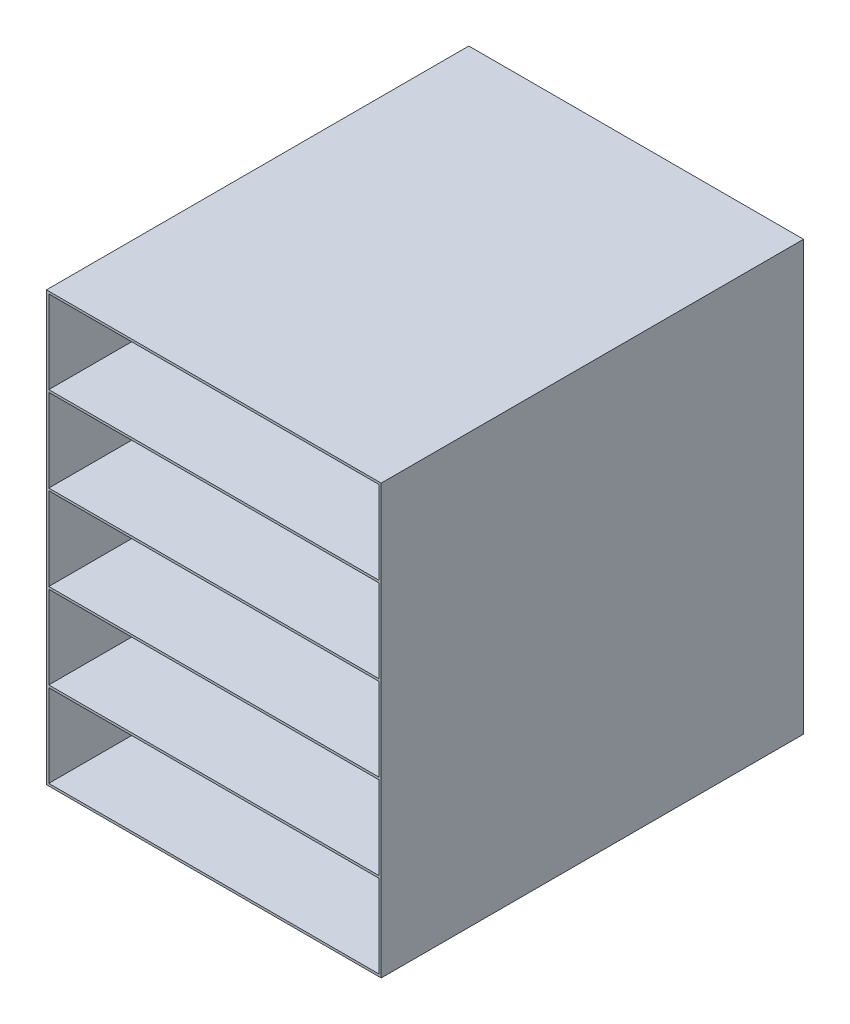
ISO-10303-21;
HEADER;
FILE_DESCRIPTION(('STEP AP214'),'2;1');
FILE_NAME('part.step','',(''),(''),'','','');
FILE_SCHEMA(('AUTOMOTIVE_DESIGN { 1 0 10303 214 1 1 1 1 }'));
ENDSEC;
DATA;
#1=APPLICATION_CONTEXT('core data for automotive mechanical design processes');
#2=APPLICATION_PROTOCOL_DEFINITION('international standard','automotive_design',2000,#1);
#3=PRODUCT_CONTEXT('',#1,'mechanical');
#4=PRODUCT('Part','Part','',(#3));
#5=PRODUCT_RELATED_PRODUCT_CATEGORY('part','',(#4));
#6=PRODUCT_DEFINITION_FORMATION('','',#4);
#7=PRODUCT_DEFINITION_CONTEXT('part definition',#1,'design');
#8=PRODUCT_DEFINITION('design','',#6,#7);
#9=PRODUCT_DEFINITION_SHAPE('','',#8);
#10=(LENGTH_UNIT() NAMED_UNIT(*) SI_UNIT(.MILLI.,.METRE.));
#11=(NAMED_UNIT(*) PLANE_ANGLE_UNIT() SI_UNIT($,.RADIAN.));
#12=(NAMED_UNIT(*) SI_UNIT($,.STERADIAN.) SOLID_ANGLE_UNIT());
#13=UNCERTAINTY_MEASURE_WITH_UNIT(LENGTH_MEASURE(1.E-05),#10,'distance_accuracy_value','');
#14=(GEOMETRIC_REPRESENTATION_CONTEXT(3) GLOBAL_UNCERTAINTY_ASSIGNED_CONTEXT((#13)) GLOBAL_UNIT_ASSIGNED_CONTEXT((#10,
#11,#12)) REPRESENTATION_CONTEXT('',''));
#15=CARTESIAN_POINT('',(0.,0.,0.));
#16=DIRECTION('',(0.,0.,1.));
#17=DIRECTION('',(1.,0.,0.));
#18=AXIS2_PLACEMENT_3D('',#15,#16,#17);
#19=CARTESIAN_POINT('',(0.,0.,135.));
#20=DIRECTION('',(0.,0.,-1.));
#21=DIRECTION('',(-1.,0.,0.));
#22=AXIS2_PLACEMENT_3D('',#19,#20,#21);
#23=PLANE('',#22);
#24=DIRECTION('',(-1.,0.,0.));
#25=VECTOR('',#24,1.);
#26=CARTESIAN_POINT('',(52.75,40.5,135.));
#27=LINE('',#26,#25);
#28=CARTESIAN_POINT('',(52.75,40.5,135.));
#29=VERTEX_POINT('',#28);
#30=CARTESIAN_POINT('',(-52.75,40.5,135.));
#31=VERTEX_POINT('',#30);
#32=EDGE_CURVE('E230',#29,#31,#27,.T.);
#33=ORIENTED_EDGE('',*,*,#32,.F.);
#34=DIRECTION('',(0.,1.,0.));
#35=VECTOR('',#34,1.);
#36=CARTESIAN_POINT('',(52.75,14.,135.));
#37=LINE('',#36,#35);
#38=CARTESIAN_POINT('',(52.75,14.,135.));
#39=VERTEX_POINT('',#38);
#40=EDGE_CURVE('E220',#39,#29,#37,.T.);
#41=ORIENTED_EDGE('',*,*,#40,.F.);
#42=DIRECTION('',(1.,0.,0.));
#43=VECTOR('',#42,1.);
#44=CARTESIAN_POINT('',(-52.75,14.,135.));
#45=LINE('',#44,#43);
#46=CARTESIAN_POINT('',(-52.75,14.,135.));
#47=VERTEX_POINT('',#46);
#48=EDGE_CURVE('E234',#47,#39,#45,.T.);
#49=ORIENTED_EDGE('',*,*,#48,.F.);
#50=DIRECTION('',(0.,-1.,0.));
#51=VECTOR('',#50,1.);
#52=CARTESIAN_POINT('',(-52.75,40.5,135.));
#53=LINE('',#52,#51);
#54=EDGE_CURVE('E55',#31,#47,#53,.T.);
#55=ORIENTED_EDGE('',*,*,#54,.F.);
#56=EDGE_LOOP('',(#33,#41,#49,#55));
#57=FACE_BOUND('',#56,.T.);
#58=DIRECTION('',(-1.,0.,0.));
#59=VECTOR('',#58,1.);
#60=CARTESIAN_POINT('',(52.75,67.75,135.));
#61=LINE('',#60,#59);
#62=CARTESIAN_POINT('',(52.75,67.75,135.));
#63=VERTEX_POINT('',#62);
#64=CARTESIAN_POINT('',(-52.75,67.75,135.));
#65=VERTEX_POINT('',#64);
#66=EDGE_CURVE('E253',#63,#65,#61,.T.);
#67=ORIENTED_EDGE('',*,*,#66,.F.);
#68=DIRECTION('',(0.,1.,0.));
#69=VECTOR('',#68,1.);
#70=CARTESIAN_POINT('',(52.75,41.25,135.));
#71=LINE('',#70,#69);
#72=CARTESIAN_POINT('',(52.75,41.25,135.));
#73=VERTEX_POINT('',#72);
#74=EDGE_CURVE('E257',#73,#63,#71,.T.);
#75=ORIENTED_EDGE('',*,*,#74,.F.);
#76=DIRECTION('',(1.,0.,0.));
#77=VECTOR('',#76,1.);
#78=CARTESIAN_POINT('',(-52.75,41.25,135.));
#79=LINE('',#78,#77);
#80=CARTESIAN_POINT('',(-52.75,41.25,135.));
#81=VERTEX_POINT('',#80);
#82=EDGE_CURVE('E261',#81,#73,#79,.T.);
#83=ORIENTED_EDGE('',*,*,#82,.F.);
#84=DIRECTION('',(0.,-1.,0.));
#85=VECTOR('',#84,1.);
#86=CARTESIAN_POINT('',(-52.75,67.75,135.));
#87=LINE('',#86,#85);
#88=EDGE_CURVE('E63',#65,#81,#87,.T.);
#89=ORIENTED_EDGE('',*,*,#88,.F.);
#90=EDGE_LOOP('',(#67,#75,#83,#89));
#91=FACE_BOUND('',#90,.T.);
#92=DIRECTION('',(-1.,0.,0.));
#93=VECTOR('',#92,1.);
#94=CARTESIAN_POINT('',(52.75,95.,135.));
#95=LINE('',#94,#93);
#96=CARTESIAN_POINT('',(52.75,95.,135.));
#97=VERTEX_POINT('',#96);
#98=CARTESIAN_POINT('',(-52.75,95.,135.));
#99=VERTEX_POINT('',#98);
#100=EDGE_CURVE('E297',#97,#99,#95,.T.);
#101=ORIENTED_EDGE('',*,*,#100,.F.);
#102=DIRECTION('',(0.,1.,0.));
#103=VECTOR('',#102,1.);
#104=CARTESIAN_POINT('',(52.75,68.5,135.));
#105=LINE('',#104,#103);
#106=CARTESIAN_POINT('',(52.75,68.5,135.));
#107=VERTEX_POINT('',#106);
#108=EDGE_CURVE('E301',#107,#97,#105,.T.);
#109=ORIENTED_EDGE('',*,*,#108,.F.);
#110=DIRECTION('',(1.,0.,0.));
#111=VECTOR('',#110,1.);
#112=CARTESIAN_POINT('',(-52.75,68.5,135.));
#113=LINE('',#112,#111);
#114=CARTESIAN_POINT('',(-52.75,68.5,135.));
#115=VERTEX_POINT('',#114);
#116=EDGE_CURVE('E305',#115,#107,#113,.T.);
#117=ORIENTED_EDGE('',*,*,#116,.F.);
#118=DIRECTION('',(0.,-1.,0.));
#119=VECTOR('',#118,1.);
#120=CARTESIAN_POINT('',(-52.75,95.,135.));
#121=LINE('',#120,#119);
#122=EDGE_CURVE('E293',#99,#115,#121,.T.);
#123=ORIENTED_EDGE('',*,*,#122,.F.);
#124=EDGE_LOOP('',(#101,#109,#117,#123));
#125=FACE_BOUND('',#124,.T.);
#126=DIRECTION('',(-1.,0.,0.));
#127=VECTOR('',#126,1.);
#128=CARTESIAN_POINT('',(52.75,122.25,135.));
#129=LINE('',#128,#127);
#130=CARTESIAN_POINT('',(52.75,122.25,135.));
#131=VERTEX_POINT('',#130);
#132=CARTESIAN_POINT('',(-52.75,122.25,135.));
#133=VERTEX_POINT('',#132);
#134=EDGE_CURVE('E341',#131,#133,#129,.T.);
#135=ORIENTED_EDGE('',*,*,#134,.F.);
#136=DIRECTION('',(0.,1.,0.));
#137=VECTOR('',#136,1.);
#138=CARTESIAN_POINT('',(52.75,95.75,135.));
#139=LINE('',#138,#137);
#140=CARTESIAN_POINT('',(52.75,95.75,135.));
#141=VERTEX_POINT('',#140);
#142=EDGE_CURVE('E345',#141,#131,#139,.T.);
#143=ORIENTED_EDGE('',*,*,#142,.F.);
#144=DIRECTION('',(1.,0.,0.));
#145=VECTOR('',#144,1.);
#146=CARTESIAN_POINT('',(-52.75,95.75,135.));
#147=LINE('',#146,#145);
#148=CARTESIAN_POINT('',(-52.75,95.75,135.));
#149=VERTEX_POINT('',#148);
#150=EDGE_CURVE('E349',#149,#141,#147,.T.);
#151=ORIENTED_EDGE('',*,*,#150,.F.);
#152=DIRECTION('',(0.,-1.,0.));
#153=VECTOR('',#152,1.);
#154=CARTESIAN_POINT('',(-52.75,122.25,135.));
#155=LINE('',#154,#153);
#156=EDGE_CURVE('E337',#133,#149,#155,.T.);
#157=ORIENTED_EDGE('',*,*,#156,.F.);
#158=EDGE_LOOP('',(#135,#143,#151,#157));
#159=FACE_BOUND('',#158,.T.);
#160=DIRECTION('',(0.,-1.,0.));
#161=VECTOR('',#160,1.);
#162=CARTESIAN_POINT('',(-52.75,0.,135.));
#163=LINE('',#162,#161);
#164=CARTESIAN_POINT('',(-52.75,13.25,135.));
#165=VERTEX_POINT('',#164);
#166=CARTESIAN_POINT('',(-52.75,-13.25,135.));
#167=VERTEX_POINT('',#166);
#168=EDGE_CURVE('E432',#165,#167,#163,.T.);
#169=ORIENTED_EDGE('',*,*,#168,.F.);
#170=DIRECTION('',(-1.,0.,0.));
#171=VECTOR('',#170,1.);
#172=CARTESIAN_POINT('',(0.,13.25,135.));
#173=LINE('',#172,#171);
#174=CARTESIAN_POINT('',(52.75,13.25,135.));
#175=VERTEX_POINT('',#174);
#176=EDGE_CURVE('E429',#175,#165,#173,.T.);
#177=ORIENTED_EDGE('',*,*,#176,.F.);
#178=DIRECTION('',(0.,1.,0.));
#179=VECTOR('',#178,1.);
#180=CARTESIAN_POINT('',(52.75,0.,135.));
#181=LINE('',#180,#179);
#182=CARTESIAN_POINT('',(52.75,-13.25,135.));
#183=VERTEX_POINT('',#182);
#184=EDGE_CURVE('E426',#183,#175,#181,.T.);
#185=ORIENTED_EDGE('',*,*,#184,.F.);
#186=DIRECTION('',(1.,0.,0.));
#187=VECTOR('',#186,1.);
#188=CARTESIAN_POINT('',(0.,-13.25,135.));
#189=LINE('',#188,#187);
#190=EDGE_CURVE('E411',#167,#183,#189,.T.);
#191=ORIENTED_EDGE('',*,*,#190,.F.);
#192=EDGE_LOOP('',(#169,#177,#185,#191));
#193=FACE_BOUND('',#192,.T.);
#194=DIRECTION('',(0.,-1.,0.));
#195=VECTOR('',#194,1.);
#196=CARTESIAN_POINT('',(-53.5,-14.,135.));
#197=LINE('',#196,#195);
#198=CARTESIAN_POINT('',(-53.5,123.,135.));
#199=VERTEX_POINT('',#198);
#200=CARTESIAN_POINT('',(-53.5,-14.,135.));
#201=VERTEX_POINT('',#200);
#202=EDGE_CURVE('E441',#199,#201,#197,.T.);
#203=ORIENTED_EDGE('',*,*,#202,.T.);
#204=DIRECTION('',(1.,0.,0.));
#205=VECTOR('',#204,1.);
#206=CARTESIAN_POINT('',(-53.5,-14.,135.));
#207=LINE('',#206,#205);
#208=CARTESIAN_POINT('',(53.5,-14.,135.));
#209=VERTEX_POINT('',#208);
#210=EDGE_CURVE('E445',#201,#209,#207,.T.);
#211=ORIENTED_EDGE('',*,*,#210,.T.);
#212=DIRECTION('',(0.,1.,0.));
#213=VECTOR('',#212,1.);
#214=CARTESIAN_POINT('',(53.5,-14.,135.));
#215=LINE('',#214,#213);
#216=CARTESIAN_POINT('',(53.5,123.,135.));
#217=VERTEX_POINT('',#216);
#218=EDGE_CURVE('E438',#209,#217,#215,.T.);
#219=ORIENTED_EDGE('',*,*,#218,.T.);
#220=DIRECTION('',(-1.,0.,0.));
#221=VECTOR('',#220,1.);
#222=CARTESIAN_POINT('',(-53.5,123.,135.));
#223=LINE('',#222,#221);
#224=EDGE_CURVE('E380',#217,#199,#223,.T.);
#225=ORIENTED_EDGE('',*,*,#224,.T.);
#226=EDGE_LOOP('',(#203,#211,#219,#225));
#227=FACE_BOUND('',#226,.T.);
#228=ADVANCED_FACE('F39',(#57,#91,#125,#159,#193,#227),#23,.F.);
#229=CARTESIAN_POINT('',(53.5,-14.,135.));
#230=DIRECTION('',(-1.,0.,0.));
#231=DIRECTION('',(0.,0.,1.));
#232=AXIS2_PLACEMENT_3D('',#229,#230,#231);
#233=PLANE('',#232);
#234=DIRECTION('',(0.,0.,-1.));
#235=VECTOR('',#234,1.);
#236=CARTESIAN_POINT('',(53.5,123.,135.));
#237=LINE('',#236,#235);
#238=CARTESIAN_POINT('',(53.5,123.,0.));
#239=VERTEX_POINT('',#238);
#240=EDGE_CURVE('E391',#217,#239,#237,.T.);
#241=ORIENTED_EDGE('',*,*,#240,.F.);
#242=ORIENTED_EDGE('',*,*,#218,.F.);
#243=DIRECTION('',(0.,0.,-1.));
#244=VECTOR('',#243,1.);
#245=CARTESIAN_POINT('',(53.5,-14.,135.));
#246=LINE('',#245,#244);
#247=CARTESIAN_POINT('',(53.5,-14.,0.));
#248=VERTEX_POINT('',#247);
#249=EDGE_CURVE('E48',#209,#248,#246,.T.);
#250=ORIENTED_EDGE('',*,*,#249,.T.);
#251=DIRECTION('',(0.,1.,0.));
#252=VECTOR('',#251,1.);
#253=CARTESIAN_POINT('',(53.5,-14.,0.));
#254=LINE('',#253,#252);
#255=EDGE_CURVE('E404',#248,#239,#254,.T.);
#256=ORIENTED_EDGE('',*,*,#255,.T.);
#257=EDGE_LOOP('',(#241,#242,#250,#256));
#258=FACE_BOUND('',#257,.T.);
#259=ADVANCED_FACE('F41',(#258),#233,.F.);
#260=CARTESIAN_POINT('',(-53.5,-14.,135.));
#261=DIRECTION('',(1.,0.,0.));
#262=DIRECTION('',(0.,0.,-1.));
#263=AXIS2_PLACEMENT_3D('',#260,#261,#262);
#264=PLANE('',#263);
#265=DIRECTION('',(0.,-1.,0.));
#266=VECTOR('',#265,1.);
#267=CARTESIAN_POINT('',(-53.5,-14.,0.));
#268=LINE('',#267,#266);
#269=CARTESIAN_POINT('',(-53.5,123.,0.));
#270=VERTEX_POINT('',#269);
#271=CARTESIAN_POINT('',(-53.5,-14.,0.));
#272=VERTEX_POINT('',#271);
#273=EDGE_CURVE('E450',#270,#272,#268,.T.);
#274=ORIENTED_EDGE('',*,*,#273,.T.);
#275=DIRECTION('',(0.,0.,-1.));
#276=VECTOR('',#275,1.);
#277=CARTESIAN_POINT('',(-53.5,-14.,135.));
#278=LINE('',#277,#276);
#279=EDGE_CURVE('E11',#201,#272,#278,.T.);
#280=ORIENTED_EDGE('',*,*,#279,.F.);
#281=ORIENTED_EDGE('',*,*,#202,.F.);
#282=DIRECTION('',(0.,0.,-1.));
#283=VECTOR('',#282,1.);
#284=CARTESIAN_POINT('',(-53.5,123.,135.));
#285=LINE('',#284,#283);
#286=EDGE_CURVE('E384',#199,#270,#285,.T.);
#287=ORIENTED_EDGE('',*,*,#286,.T.);
#288=EDGE_LOOP('',(#274,#280,#281,#287));
#289=FACE_BOUND('',#288,.T.);
#290=ADVANCED_FACE('F475',(#289),#264,.F.);
#291=CARTESIAN_POINT('',(-53.5,-14.,135.));
#292=DIRECTION('',(0.,1.,0.));
#293=DIRECTION('',(0.,0.,1.));
#294=AXIS2_PLACEMENT_3D('',#291,#292,#293);
#295=PLANE('',#294);
#296=DIRECTION('',(1.,0.,0.));
#297=VECTOR('',#296,1.);
#298=CARTESIAN_POINT('',(-53.5,-14.,0.));
#299=LINE('',#298,#297);
#300=EDGE_CURVE('E442',#272,#248,#299,.T.);
#301=ORIENTED_EDGE('',*,*,#300,.T.);
#302=ORIENTED_EDGE('',*,*,#249,.F.);
#303=ORIENTED_EDGE('',*,*,#210,.F.);
#304=ORIENTED_EDGE('',*,*,#279,.T.);
#305=EDGE_LOOP('',(#301,#302,#303,#304));
#306=FACE_BOUND('',#305,.T.);
#307=ADVANCED_FACE('F473',(#306),#295,.F.);
#308=CARTESIAN_POINT('',(0.,0.,0.));
#309=DIRECTION('',(0.,0.,-1.));
#310=DIRECTION('',(-1.,0.,0.));
#311=AXIS2_PLACEMENT_3D('',#308,#309,#310);
#312=PLANE('',#311);
#313=DIRECTION('',(-1.,0.,0.));
#314=VECTOR('',#313,1.);
#315=CARTESIAN_POINT('',(-53.5,123.,0.));
#316=LINE('',#315,#314);
#317=EDGE_CURVE('E249',#239,#270,#316,.T.);
#318=ORIENTED_EDGE('',*,*,#317,.F.);
#319=ORIENTED_EDGE('',*,*,#255,.F.);
#320=ORIENTED_EDGE('',*,*,#300,.F.);
#321=ORIENTED_EDGE('',*,*,#273,.F.);
#322=EDGE_LOOP('',(#318,#319,#320,#321));
#323=FACE_BOUND('',#322,.T.);
#324=ADVANCED_FACE('F466',(#323),#312,.T.);
#325=CARTESIAN_POINT('',(52.75,-14.,135.));
#326=DIRECTION('',(-1.,0.,0.));
#327=DIRECTION('',(0.,0.,1.));
#328=AXIS2_PLACEMENT_3D('',#325,#326,#327);
#329=PLANE('',#328);
#330=DIRECTION('',(0.,1.,0.));
#331=VECTOR('',#330,1.);
#332=CARTESIAN_POINT('',(52.75,0.,0.75));
#333=LINE('',#332,#331);
#334=CARTESIAN_POINT('',(52.75,-13.25,0.75));
#335=VERTEX_POINT('',#334);
#336=CARTESIAN_POINT('',(52.75,13.25,0.75));
#337=VERTEX_POINT('',#336);
#338=EDGE_CURVE('E395',#335,#337,#333,.T.);
#339=ORIENTED_EDGE('',*,*,#338,.F.);
#340=DIRECTION('',(0.,0.,-1.));
#341=VECTOR('',#340,1.);
#342=CARTESIAN_POINT('',(52.75,-13.25,135.));
#343=LINE('',#342,#341);
#344=EDGE_CURVE('E406',#183,#335,#343,.T.);
#345=ORIENTED_EDGE('',*,*,#344,.F.);
#346=ORIENTED_EDGE('',*,*,#184,.T.);
#347=DIRECTION('',(0.,0.,-1.));
#348=VECTOR('',#347,1.);
#349=CARTESIAN_POINT('',(52.75,13.25,135.));
#350=LINE('',#349,#348);
#351=EDGE_CURVE('E400',#175,#337,#350,.T.);
#352=ORIENTED_EDGE('',*,*,#351,.T.);
#353=EDGE_LOOP('',(#339,#345,#346,#352));
#354=FACE_BOUND('',#353,.T.);
#355=ADVANCED_FACE('F493',(#354),#329,.T.);
#356=CARTESIAN_POINT('',(-53.5,13.25,135.));
#357=DIRECTION('',(0.,-1.,0.));
#358=DIRECTION('',(0.,0.,-1.));
#359=AXIS2_PLACEMENT_3D('',#356,#357,#358);
#360=PLANE('',#359);
#361=DIRECTION('',(-1.,0.,0.));
#362=VECTOR('',#361,1.);
#363=CARTESIAN_POINT('',(0.,13.25,0.75));
#364=LINE('',#363,#362);
#365=CARTESIAN_POINT('',(-52.75,13.25,0.75));
#366=VERTEX_POINT('',#365);
#367=EDGE_CURVE('E399',#337,#366,#364,.T.);
#368=ORIENTED_EDGE('',*,*,#367,.F.);
#369=ORIENTED_EDGE('',*,*,#351,.F.);
#370=ORIENTED_EDGE('',*,*,#176,.T.);
#371=DIRECTION('',(0.,0.,-1.));
#372=VECTOR('',#371,1.);
#373=CARTESIAN_POINT('',(-52.75,13.25,135.));
#374=LINE('',#373,#372);
#375=EDGE_CURVE('E405',#165,#366,#374,.T.);
#376=ORIENTED_EDGE('',*,*,#375,.T.);
#377=EDGE_LOOP('',(#368,#369,#370,#376));
#378=FACE_BOUND('',#377,.T.);
#379=ADVANCED_FACE('F497',(#378),#360,.T.);
#380=CARTESIAN_POINT('',(-52.75,-14.,135.));
#381=DIRECTION('',(1.,0.,0.));
#382=DIRECTION('',(0.,0.,-1.));
#383=AXIS2_PLACEMENT_3D('',#380,#381,#382);
#384=PLANE('',#383);
#385=DIRECTION('',(0.,-1.,0.));
#386=VECTOR('',#385,1.);
#387=CARTESIAN_POINT('',(-52.75,0.,0.75));
#388=LINE('',#387,#386);
#389=CARTESIAN_POINT('',(-52.75,-13.25,0.75));
#390=VERTEX_POINT('',#389);
#391=EDGE_CURVE('E414',#366,#390,#388,.T.);
#392=ORIENTED_EDGE('',*,*,#391,.F.);
#393=ORIENTED_EDGE('',*,*,#375,.F.);
#394=ORIENTED_EDGE('',*,*,#168,.T.);
#395=DIRECTION('',(0.,0.,-1.));
#396=VECTOR('',#395,1.);
#397=CARTESIAN_POINT('',(-52.75,-13.25,135.));
#398=LINE('',#397,#396);
#399=EDGE_CURVE('E410',#167,#390,#398,.T.);
#400=ORIENTED_EDGE('',*,*,#399,.T.);
#401=EDGE_LOOP('',(#392,#393,#394,#400));
#402=FACE_BOUND('',#401,.T.);
#403=ADVANCED_FACE('F503',(#402),#384,.T.);
#404=CARTESIAN_POINT('',(-53.5,-13.25,135.));
#405=DIRECTION('',(0.,1.,0.));
#406=DIRECTION('',(0.,0.,1.));
#407=AXIS2_PLACEMENT_3D('',#404,#405,#406);
#408=PLANE('',#407);
#409=DIRECTION('',(1.,0.,0.));
#410=VECTOR('',#409,1.);
#411=CARTESIAN_POINT('',(0.,-13.25,0.75));
#412=LINE('',#411,#410);
#413=EDGE_CURVE('E420',#390,#335,#412,.T.);
#414=ORIENTED_EDGE('',*,*,#413,.F.);
#415=ORIENTED_EDGE('',*,*,#399,.F.);
#416=ORIENTED_EDGE('',*,*,#190,.T.);
#417=ORIENTED_EDGE('',*,*,#344,.T.);
#418=EDGE_LOOP('',(#414,#415,#416,#417));
#419=FACE_BOUND('',#418,.T.);
#420=ADVANCED_FACE('F511',(#419),#408,.T.);
#421=CARTESIAN_POINT('',(0.,0.,0.75));
#422=DIRECTION('',(0.,0.,-1.));
#423=DIRECTION('',(-1.,0.,0.));
#424=AXIS2_PLACEMENT_3D('',#421,#422,#423);
#425=PLANE('',#424);
#426=ORIENTED_EDGE('',*,*,#338,.T.);
#427=ORIENTED_EDGE('',*,*,#367,.T.);
#428=ORIENTED_EDGE('',*,*,#391,.T.);
#429=ORIENTED_EDGE('',*,*,#413,.T.);
#430=EDGE_LOOP('',(#426,#427,#428,#429));
#431=FACE_BOUND('',#430,.T.);
#432=ADVANCED_FACE('F490',(#431),#425,.F.);
#433=CARTESIAN_POINT('',(-53.5,123.,135.));
#434=DIRECTION('',(0.,-1.,0.));
#435=DIRECTION('',(0.,0.,-1.));
#436=AXIS2_PLACEMENT_3D('',#433,#434,#435);
#437=PLANE('',#436);
#438=ORIENTED_EDGE('',*,*,#317,.T.);
#439=ORIENTED_EDGE('',*,*,#286,.F.);
#440=ORIENTED_EDGE('',*,*,#224,.F.);
#441=ORIENTED_EDGE('',*,*,#240,.T.);
#442=EDGE_LOOP('',(#438,#439,#440,#441));
#443=FACE_BOUND('',#442,.T.);
#444=ADVANCED_FACE('F470',(#443),#437,.F.);
#445=CARTESIAN_POINT('',(0.,0.,0.75));
#446=DIRECTION('',(0.,0.,-1.));
#447=DIRECTION('',(-1.,0.,0.));
#448=AXIS2_PLACEMENT_3D('',#445,#446,#447);
#449=PLANE('',#448);
#450=DIRECTION('',(1.,0.,0.));
#451=VECTOR('',#450,1.);
#452=CARTESIAN_POINT('',(-52.75,95.75,0.750000000000001));
#453=LINE('',#452,#451);
#454=CARTESIAN_POINT('',(-52.75,95.75,0.750000000000001));
#455=VERTEX_POINT('',#454);
#456=CARTESIAN_POINT('',(52.75,95.75,0.750000000000001));
#457=VERTEX_POINT('',#456);
#458=EDGE_CURVE('E357',#455,#457,#453,.T.);
#459=ORIENTED_EDGE('',*,*,#458,.T.);
#460=DIRECTION('',(0.,1.,0.));
#461=VECTOR('',#460,1.);
#462=CARTESIAN_POINT('',(52.75,95.75,0.750000000000001));
#463=LINE('',#462,#461);
#464=CARTESIAN_POINT('',(52.75,122.25,0.750000000000001));
#465=VERTEX_POINT('',#464);
#466=EDGE_CURVE('E340',#457,#465,#463,.T.);
#467=ORIENTED_EDGE('',*,*,#466,.T.);
#468=DIRECTION('',(-1.,0.,0.));
#469=VECTOR('',#468,1.);
#470=CARTESIAN_POINT('',(52.75,122.25,0.750000000000001));
#471=LINE('',#470,#469);
#472=CARTESIAN_POINT('',(-52.75,122.25,0.750000000000001));
#473=VERTEX_POINT('',#472);
#474=EDGE_CURVE('E367',#465,#473,#471,.T.);
#475=ORIENTED_EDGE('',*,*,#474,.T.);
#476=DIRECTION('',(0.,-1.,0.));
#477=VECTOR('',#476,1.);
#478=CARTESIAN_POINT('',(-52.75,122.25,0.750000000000001));
#479=LINE('',#478,#477);
#480=EDGE_CURVE('E362',#473,#455,#479,.T.);
#481=ORIENTED_EDGE('',*,*,#480,.T.);
#482=EDGE_LOOP('',(#459,#467,#475,#481));
#483=FACE_BOUND('',#482,.T.);
#484=ADVANCED_FACE('F532',(#483),#449,.F.);
#485=CARTESIAN_POINT('',(52.75,95.75,-108.027295425102));
#486=DIRECTION('',(1.,0.,0.));
#487=DIRECTION('',(0.,0.,-1.));
#488=AXIS2_PLACEMENT_3D('',#485,#486,#487);
#489=PLANE('',#488);
#490=DIRECTION('',(0.,0.,1.));
#491=VECTOR('',#490,1.);
#492=CARTESIAN_POINT('',(52.75,95.75,-108.027295425102));
#493=LINE('',#492,#491);
#494=EDGE_CURVE('E309',#457,#141,#493,.T.);
#495=ORIENTED_EDGE('',*,*,#494,.T.);
#496=ORIENTED_EDGE('',*,*,#142,.T.);
#497=DIRECTION('',(0.,0.,1.));
#498=VECTOR('',#497,1.);
#499=CARTESIAN_POINT('',(52.75,122.25,-108.027295425102));
#500=LINE('',#499,#498);
#501=EDGE_CURVE('E356',#465,#131,#500,.T.);
#502=ORIENTED_EDGE('',*,*,#501,.F.);
#503=ORIENTED_EDGE('',*,*,#466,.F.);
#504=EDGE_LOOP('',(#495,#496,#502,#503));
#505=FACE_BOUND('',#504,.T.);
#506=ADVANCED_FACE('F536',(#505),#489,.F.);
#507=CARTESIAN_POINT('',(52.75,122.25,-108.027295425102));
#508=DIRECTION('',(0.,1.,0.));
#509=DIRECTION('',(0.,0.,1.));
#510=AXIS2_PLACEMENT_3D('',#507,#508,#509);
#511=PLANE('',#510);
#512=ORIENTED_EDGE('',*,*,#501,.T.);
#513=ORIENTED_EDGE('',*,*,#134,.T.);
#514=DIRECTION('',(0.,0.,1.));
#515=VECTOR('',#514,1.);
#516=CARTESIAN_POINT('',(-52.75,122.25,-108.027295425102));
#517=LINE('',#516,#515);
#518=EDGE_CURVE('E366',#473,#133,#517,.T.);
#519=ORIENTED_EDGE('',*,*,#518,.F.);
#520=ORIENTED_EDGE('',*,*,#474,.F.);
#521=EDGE_LOOP('',(#512,#513,#519,#520));
#522=FACE_BOUND('',#521,.T.);
#523=ADVANCED_FACE('F541',(#522),#511,.F.);
#524=CARTESIAN_POINT('',(-52.75,122.25,-108.027295425102));
#525=DIRECTION('',(-1.,0.,0.));
#526=DIRECTION('',(0.,0.,1.));
#527=AXIS2_PLACEMENT_3D('',#524,#525,#526);
#528=PLANE('',#527);
#529=ORIENTED_EDGE('',*,*,#518,.T.);
#530=ORIENTED_EDGE('',*,*,#156,.T.);
#531=DIRECTION('',(0.,0.,1.));
#532=VECTOR('',#531,1.);
#533=CARTESIAN_POINT('',(-52.75,95.75,-108.027295425102));
#534=LINE('',#533,#532);
#535=EDGE_CURVE('E361',#455,#149,#534,.T.);
#536=ORIENTED_EDGE('',*,*,#535,.F.);
#537=ORIENTED_EDGE('',*,*,#480,.F.);
#538=EDGE_LOOP('',(#529,#530,#536,#537));
#539=FACE_BOUND('',#538,.T.);
#540=ADVANCED_FACE('F547',(#539),#528,.F.);
#541=CARTESIAN_POINT('',(-52.75,95.75,-108.027295425102));
#542=DIRECTION('',(0.,-1.,0.));
#543=DIRECTION('',(0.,0.,-1.));
#544=AXIS2_PLACEMENT_3D('',#541,#542,#543);
#545=PLANE('',#544);
#546=ORIENTED_EDGE('',*,*,#535,.T.);
#547=ORIENTED_EDGE('',*,*,#150,.T.);
#548=ORIENTED_EDGE('',*,*,#494,.F.);
#549=ORIENTED_EDGE('',*,*,#458,.F.);
#550=EDGE_LOOP('',(#546,#547,#548,#549));
#551=FACE_BOUND('',#550,.T.);
#552=ADVANCED_FACE('F551',(#551),#545,.F.);
#553=CARTESIAN_POINT('',(0.,0.,0.75));
#554=DIRECTION('',(0.,0.,-1.));
#555=DIRECTION('',(-1.,0.,0.));
#556=AXIS2_PLACEMENT_3D('',#553,#554,#555);
#557=PLANE('',#556);
#558=DIRECTION('',(1.,0.,0.));
#559=VECTOR('',#558,1.);
#560=CARTESIAN_POINT('',(-52.75,68.5,0.750000000000001));
#561=LINE('',#560,#559);
#562=CARTESIAN_POINT('',(-52.75,68.5,0.750000000000001));
#563=VERTEX_POINT('',#562);
#564=CARTESIAN_POINT('',(52.75,68.5,0.750000000000001));
#565=VERTEX_POINT('',#564);
#566=EDGE_CURVE('E314',#563,#565,#561,.T.);
#567=ORIENTED_EDGE('',*,*,#566,.T.);
#568=DIRECTION('',(0.,1.,0.));
#569=VECTOR('',#568,1.);
#570=CARTESIAN_POINT('',(52.75,68.5,0.750000000000001));
#571=LINE('',#570,#569);
#572=CARTESIAN_POINT('',(52.75,95.,0.750000000000001));
#573=VERTEX_POINT('',#572);
#574=EDGE_CURVE('E296',#565,#573,#571,.T.);
#575=ORIENTED_EDGE('',*,*,#574,.T.);
#576=DIRECTION('',(-1.,0.,0.));
#577=VECTOR('',#576,1.);
#578=CARTESIAN_POINT('',(52.75,95.,0.750000000000001));
#579=LINE('',#578,#577);
#580=CARTESIAN_POINT('',(-52.75,95.,0.750000000000001));
#581=VERTEX_POINT('',#580);
#582=EDGE_CURVE('E324',#573,#581,#579,.T.);
#583=ORIENTED_EDGE('',*,*,#582,.T.);
#584=DIRECTION('',(0.,-1.,0.));
#585=VECTOR('',#584,1.);
#586=CARTESIAN_POINT('',(-52.75,95.,0.750000000000001));
#587=LINE('',#586,#585);
#588=EDGE_CURVE('E319',#581,#563,#587,.T.);
#589=ORIENTED_EDGE('',*,*,#588,.T.);
#590=EDGE_LOOP('',(#567,#575,#583,#589));
#591=FACE_BOUND('',#590,.T.);
#592=ADVANCED_FACE('F555',(#591),#557,.F.);
#593=CARTESIAN_POINT('',(52.75,68.5,-108.027295425102));
#594=DIRECTION('',(1.,0.,0.));
#595=DIRECTION('',(0.,0.,-1.));
#596=AXIS2_PLACEMENT_3D('',#593,#594,#595);
#597=PLANE('',#596);
#598=DIRECTION('',(0.,0.,1.));
#599=VECTOR('',#598,1.);
#600=CARTESIAN_POINT('',(52.75,68.5,-108.027295425102));
#601=LINE('',#600,#599);
#602=EDGE_CURVE('E265',#565,#107,#601,.T.);
#603=ORIENTED_EDGE('',*,*,#602,.T.);
#604=ORIENTED_EDGE('',*,*,#108,.T.);
#605=DIRECTION('',(0.,0.,1.));
#606=VECTOR('',#605,1.);
#607=CARTESIAN_POINT('',(52.75,95.,-108.027295425102));
#608=LINE('',#607,#606);
#609=EDGE_CURVE('E313',#573,#97,#608,.T.);
#610=ORIENTED_EDGE('',*,*,#609,.F.);
#611=ORIENTED_EDGE('',*,*,#574,.F.);
#612=EDGE_LOOP('',(#603,#604,#610,#611));
#613=FACE_BOUND('',#612,.T.);
#614=ADVANCED_FACE('F559',(#613),#597,.F.);
#615=CARTESIAN_POINT('',(52.75,95.,-108.027295425102));
#616=DIRECTION('',(0.,1.,0.));
#617=DIRECTION('',(0.,0.,1.));
#618=AXIS2_PLACEMENT_3D('',#615,#616,#617);
#619=PLANE('',#618);
#620=ORIENTED_EDGE('',*,*,#609,.T.);
#621=ORIENTED_EDGE('',*,*,#100,.T.);
#622=DIRECTION('',(0.,0.,1.));
#623=VECTOR('',#622,1.);
#624=CARTESIAN_POINT('',(-52.75,95.,-108.027295425102));
#625=LINE('',#624,#623);
#626=EDGE_CURVE('E323',#581,#99,#625,.T.);
#627=ORIENTED_EDGE('',*,*,#626,.F.);
#628=ORIENTED_EDGE('',*,*,#582,.F.);
#629=EDGE_LOOP('',(#620,#621,#627,#628));
#630=FACE_BOUND('',#629,.T.);
#631=ADVANCED_FACE('F563',(#630),#619,.F.);
#632=CARTESIAN_POINT('',(-52.75,95.,-108.027295425102));
#633=DIRECTION('',(-1.,0.,0.));
#634=DIRECTION('',(0.,0.,1.));
#635=AXIS2_PLACEMENT_3D('',#632,#633,#634);
#636=PLANE('',#635);
#637=ORIENTED_EDGE('',*,*,#626,.T.);
#638=ORIENTED_EDGE('',*,*,#122,.T.);
#639=DIRECTION('',(0.,0.,1.));
#640=VECTOR('',#639,1.);
#641=CARTESIAN_POINT('',(-52.75,68.5,-108.027295425102));
#642=LINE('',#641,#640);
#643=EDGE_CURVE('E318',#563,#115,#642,.T.);
#644=ORIENTED_EDGE('',*,*,#643,.F.);
#645=ORIENTED_EDGE('',*,*,#588,.F.);
#646=EDGE_LOOP('',(#637,#638,#644,#645));
#647=FACE_BOUND('',#646,.T.);
#648=ADVANCED_FACE('F567',(#647),#636,.F.);
#649=CARTESIAN_POINT('',(-52.75,68.5,-108.027295425102));
#650=DIRECTION('',(0.,-1.,0.));
#651=DIRECTION('',(0.,0.,-1.));
#652=AXIS2_PLACEMENT_3D('',#649,#650,#651);
#653=PLANE('',#652);
#654=ORIENTED_EDGE('',*,*,#643,.T.);
#655=ORIENTED_EDGE('',*,*,#116,.T.);
#656=ORIENTED_EDGE('',*,*,#602,.F.);
#657=ORIENTED_EDGE('',*,*,#566,.F.);
#658=EDGE_LOOP('',(#654,#655,#656,#657));
#659=FACE_BOUND('',#658,.T.);
#660=ADVANCED_FACE('F571',(#659),#653,.F.);
#661=CARTESIAN_POINT('',(0.,0.,0.75));
#662=DIRECTION('',(0.,0.,-1.));
#663=DIRECTION('',(-1.,0.,0.));
#664=AXIS2_PLACEMENT_3D('',#661,#662,#663);
#665=PLANE('',#664);
#666=DIRECTION('',(1.,0.,0.));
#667=VECTOR('',#666,1.);
#668=CARTESIAN_POINT('',(-52.75,41.25,0.750000000000001));
#669=LINE('',#668,#667);
#670=CARTESIAN_POINT('',(-52.75,41.25,0.750000000000001));
#671=VERTEX_POINT('',#670);
#672=CARTESIAN_POINT('',(52.75,41.25,0.750000000000001));
#673=VERTEX_POINT('',#672);
#674=EDGE_CURVE('E270',#671,#673,#669,.T.);
#675=ORIENTED_EDGE('',*,*,#674,.T.);
#676=DIRECTION('',(0.,1.,0.));
#677=VECTOR('',#676,1.);
#678=CARTESIAN_POINT('',(52.75,41.25,0.750000000000001));
#679=LINE('',#678,#677);
#680=CARTESIAN_POINT('',(52.75,67.75,0.750000000000001));
#681=VERTEX_POINT('',#680);
#682=EDGE_CURVE('E252',#673,#681,#679,.T.);
#683=ORIENTED_EDGE('',*,*,#682,.T.);
#684=DIRECTION('',(-1.,0.,0.));
#685=VECTOR('',#684,1.);
#686=CARTESIAN_POINT('',(52.75,67.75,0.750000000000001));
#687=LINE('',#686,#685);
#688=CARTESIAN_POINT('',(-52.75,67.75,0.750000000000001));
#689=VERTEX_POINT('',#688);
#690=EDGE_CURVE('E281',#681,#689,#687,.T.);
#691=ORIENTED_EDGE('',*,*,#690,.T.);
#692=DIRECTION('',(0.,-1.,0.));
#693=VECTOR('',#692,1.);
#694=CARTESIAN_POINT('',(-52.75,67.75,0.750000000000001));
#695=LINE('',#694,#693);
#696=EDGE_CURVE('E276',#689,#671,#695,.T.);
#697=ORIENTED_EDGE('',*,*,#696,.T.);
#698=EDGE_LOOP('',(#675,#683,#691,#697));
#699=FACE_BOUND('',#698,.T.);
#700=ADVANCED_FACE('F575',(#699),#665,.F.);
#701=CARTESIAN_POINT('',(52.75,41.25,-108.027295425102));
#702=DIRECTION('',(1.,0.,0.));
#703=DIRECTION('',(0.,0.,-1.));
#704=AXIS2_PLACEMENT_3D('',#701,#702,#703);
#705=PLANE('',#704);
#706=DIRECTION('',(0.,0.,1.));
#707=VECTOR('',#706,1.);
#708=CARTESIAN_POINT('',(52.75,41.25,-108.027295425102));
#709=LINE('',#708,#707);
#710=EDGE_CURVE('E274',#673,#73,#709,.T.);
#711=ORIENTED_EDGE('',*,*,#710,.T.);
#712=ORIENTED_EDGE('',*,*,#74,.T.);
#713=DIRECTION('',(0.,0.,1.));
#714=VECTOR('',#713,1.);
#715=CARTESIAN_POINT('',(52.75,67.75,-108.027295425102));
#716=LINE('',#715,#714);
#717=EDGE_CURVE('E269',#681,#63,#716,.T.);
#718=ORIENTED_EDGE('',*,*,#717,.F.);
#719=ORIENTED_EDGE('',*,*,#682,.F.);
#720=EDGE_LOOP('',(#711,#712,#718,#719));
#721=FACE_BOUND('',#720,.T.);
#722=ADVANCED_FACE('F579',(#721),#705,.F.);
#723=CARTESIAN_POINT('',(52.75,67.75,-108.027295425102));
#724=DIRECTION('',(0.,1.,0.));
#725=DIRECTION('',(0.,0.,1.));
#726=AXIS2_PLACEMENT_3D('',#723,#724,#725);
#727=PLANE('',#726);
#728=ORIENTED_EDGE('',*,*,#717,.T.);
#729=ORIENTED_EDGE('',*,*,#66,.T.);
#730=DIRECTION('',(0.,0.,1.));
#731=VECTOR('',#730,1.);
#732=CARTESIAN_POINT('',(-52.75,67.75,-108.027295425102));
#733=LINE('',#732,#731);
#734=EDGE_CURVE('E280',#689,#65,#733,.T.);
#735=ORIENTED_EDGE('',*,*,#734,.F.);
#736=ORIENTED_EDGE('',*,*,#690,.F.);
#737=EDGE_LOOP('',(#728,#729,#735,#736));
#738=FACE_BOUND('',#737,.T.);
#739=ADVANCED_FACE('F583',(#738),#727,.F.);
#740=CARTESIAN_POINT('',(-52.75,67.75,-108.027295425102));
#741=DIRECTION('',(-1.,0.,0.));
#742=DIRECTION('',(0.,0.,1.));
#743=AXIS2_PLACEMENT_3D('',#740,#741,#742);
#744=PLANE('',#743);
#745=ORIENTED_EDGE('',*,*,#734,.T.);
#746=ORIENTED_EDGE('',*,*,#88,.T.);
#747=DIRECTION('',(0.,0.,1.));
#748=VECTOR('',#747,1.);
#749=CARTESIAN_POINT('',(-52.75,41.25,-108.027295425102));
#750=LINE('',#749,#748);
#751=EDGE_CURVE('E275',#671,#81,#750,.T.);
#752=ORIENTED_EDGE('',*,*,#751,.F.);
#753=ORIENTED_EDGE('',*,*,#696,.F.);
#754=EDGE_LOOP('',(#745,#746,#752,#753));
#755=FACE_BOUND('',#754,.T.);
#756=ADVANCED_FACE('F587',(#755),#744,.F.);
#757=CARTESIAN_POINT('',(-52.75,41.25,-108.027295425102));
#758=DIRECTION('',(0.,-1.,0.));
#759=DIRECTION('',(0.,0.,-1.));
#760=AXIS2_PLACEMENT_3D('',#757,#758,#759);
#761=PLANE('',#760);
#762=ORIENTED_EDGE('',*,*,#751,.T.);
#763=ORIENTED_EDGE('',*,*,#82,.T.);
#764=ORIENTED_EDGE('',*,*,#710,.F.);
#765=ORIENTED_EDGE('',*,*,#674,.F.);
#766=EDGE_LOOP('',(#762,#763,#764,#765));
#767=FACE_BOUND('',#766,.T.);
#768=ADVANCED_FACE('F591',(#767),#761,.F.);
#769=CARTESIAN_POINT('',(0.,0.,0.75));
#770=DIRECTION('',(0.,0.,-1.));
#771=DIRECTION('',(-1.,0.,0.));
#772=AXIS2_PLACEMENT_3D('',#769,#770,#771);
#773=PLANE('',#772);
#774=DIRECTION('',(1.,0.,0.));
#775=VECTOR('',#774,1.);
#776=CARTESIAN_POINT('',(-52.75,14.,0.750000000000001));
#777=LINE('',#776,#775);
#778=CARTESIAN_POINT('',(-52.75,14.,0.750000000000001));
#779=VERTEX_POINT('',#778);
#780=CARTESIAN_POINT('',(52.75,14.,0.750000000000001));
#781=VERTEX_POINT('',#780);
#782=EDGE_CURVE('E225',#779,#781,#777,.T.);
#783=ORIENTED_EDGE('',*,*,#782,.T.);
#784=DIRECTION('',(0.,1.,0.));
#785=VECTOR('',#784,1.);
#786=CARTESIAN_POINT('',(52.75,14.,0.750000000000001));
#787=LINE('',#786,#785);
#788=CARTESIAN_POINT('',(52.75,40.5,0.750000000000001));
#789=VERTEX_POINT('',#788);
#790=EDGE_CURVE('E217',#781,#789,#787,.T.);
#791=ORIENTED_EDGE('',*,*,#790,.T.);
#792=DIRECTION('',(-1.,0.,0.));
#793=VECTOR('',#792,1.);
#794=CARTESIAN_POINT('',(52.75,40.5,0.750000000000001));
#795=LINE('',#794,#793);
#796=CARTESIAN_POINT('',(-52.75,40.5,0.750000000000001));
#797=VERTEX_POINT('',#796);
#798=EDGE_CURVE('E203',#789,#797,#795,.T.);
#799=ORIENTED_EDGE('',*,*,#798,.T.);
#800=DIRECTION('',(0.,-1.,0.));
#801=VECTOR('',#800,1.);
#802=CARTESIAN_POINT('',(-52.75,40.5,0.750000000000001));
#803=LINE('',#802,#801);
#804=EDGE_CURVE('E240',#797,#779,#803,.T.);
#805=ORIENTED_EDGE('',*,*,#804,.T.);
#806=EDGE_LOOP('',(#783,#791,#799,#805));
#807=FACE_BOUND('',#806,.T.);
#808=ADVANCED_FACE('F224',(#807),#773,.F.);
#809=CARTESIAN_POINT('',(52.75,14.,-108.027295425102));
#810=DIRECTION('',(1.,0.,0.));
#811=DIRECTION('',(0.,0.,-1.));
#812=AXIS2_PLACEMENT_3D('',#809,#810,#811);
#813=PLANE('',#812);
#814=DIRECTION('',(0.,0.,1.));
#815=VECTOR('',#814,1.);
#816=CARTESIAN_POINT('',(52.75,14.,-108.027295425102));
#817=LINE('',#816,#815);
#818=EDGE_CURVE('E238',#781,#39,#817,.T.);
#819=ORIENTED_EDGE('',*,*,#818,.T.);
#820=ORIENTED_EDGE('',*,*,#40,.T.);
#821=DIRECTION('',(0.,0.,1.));
#822=VECTOR('',#821,1.);
#823=CARTESIAN_POINT('',(52.75,40.5,-108.027295425102));
#824=LINE('',#823,#822);
#825=EDGE_CURVE('E207',#789,#29,#824,.T.);
#826=ORIENTED_EDGE('',*,*,#825,.F.);
#827=ORIENTED_EDGE('',*,*,#790,.F.);
#828=EDGE_LOOP('',(#819,#820,#826,#827));
#829=FACE_BOUND('',#828,.T.);
#830=ADVANCED_FACE('F216',(#829),#813,.F.);
#831=CARTESIAN_POINT('',(52.75,40.5,-108.027295425102));
#832=DIRECTION('',(0.,1.,0.));
#833=DIRECTION('',(0.,0.,1.));
#834=AXIS2_PLACEMENT_3D('',#831,#832,#833);
#835=PLANE('',#834);
#836=ORIENTED_EDGE('',*,*,#825,.T.);
#837=ORIENTED_EDGE('',*,*,#32,.T.);
#838=DIRECTION('',(0.,0.,1.));
#839=VECTOR('',#838,1.);
#840=CARTESIAN_POINT('',(-52.75,40.5,-108.027295425102));
#841=LINE('',#840,#839);
#842=EDGE_CURVE('E209',#797,#31,#841,.T.);
#843=ORIENTED_EDGE('',*,*,#842,.F.);
#844=ORIENTED_EDGE('',*,*,#798,.F.);
#845=EDGE_LOOP('',(#836,#837,#843,#844));
#846=FACE_BOUND('',#845,.T.);
#847=ADVANCED_FACE('F205',(#846),#835,.F.);
#848=CARTESIAN_POINT('',(-52.75,40.5,-108.027295425102));
#849=DIRECTION('',(-1.,0.,0.));
#850=DIRECTION('',(0.,0.,1.));
#851=AXIS2_PLACEMENT_3D('',#848,#849,#850);
#852=PLANE('',#851);
#853=ORIENTED_EDGE('',*,*,#842,.T.);
#854=ORIENTED_EDGE('',*,*,#54,.T.);
#855=DIRECTION('',(0.,0.,1.));
#856=VECTOR('',#855,1.);
#857=CARTESIAN_POINT('',(-52.75,14.,-108.027295425102));
#858=LINE('',#857,#856);
#859=EDGE_CURVE('E239',#779,#47,#858,.T.);
#860=ORIENTED_EDGE('',*,*,#859,.F.);
#861=ORIENTED_EDGE('',*,*,#804,.F.);
#862=EDGE_LOOP('',(#853,#854,#860,#861));
#863=FACE_BOUND('',#862,.T.);
#864=ADVANCED_FACE('F601',(#863),#852,.F.);
#865=CARTESIAN_POINT('',(-52.75,14.,-108.027295425102));
#866=DIRECTION('',(0.,-1.,0.));
#867=DIRECTION('',(0.,0.,-1.));
#868=AXIS2_PLACEMENT_3D('',#865,#866,#867);
#869=PLANE('',#868);
#870=ORIENTED_EDGE('',*,*,#859,.T.);
#871=ORIENTED_EDGE('',*,*,#48,.T.);
#872=ORIENTED_EDGE('',*,*,#818,.F.);
#873=ORIENTED_EDGE('',*,*,#782,.F.);
#874=EDGE_LOOP('',(#870,#871,#872,#873));
#875=FACE_BOUND('',#874,.T.);
#876=ADVANCED_FACE('F604',(#875),#869,.F.);
#877=CLOSED_SHELL('',(#228,#259,#290,#307,#324,#355,#379,#403,#420,#432,#444,#484,#506,#523,
#540,#552,#592,#614,#631,#648,#660,#700,#722,#739,#756,#768,#808,#830,#847,#864,#876));
#878=MANIFOLD_SOLID_BREP('B2',#877);
#879=ADVANCED_BREP_SHAPE_REPRESENTATION('',(#18,#878),#14);
#880=SHAPE_DEFINITION_REPRESENTATION(#9,#879);
ENDSEC;
END-ISO-10303-21;
